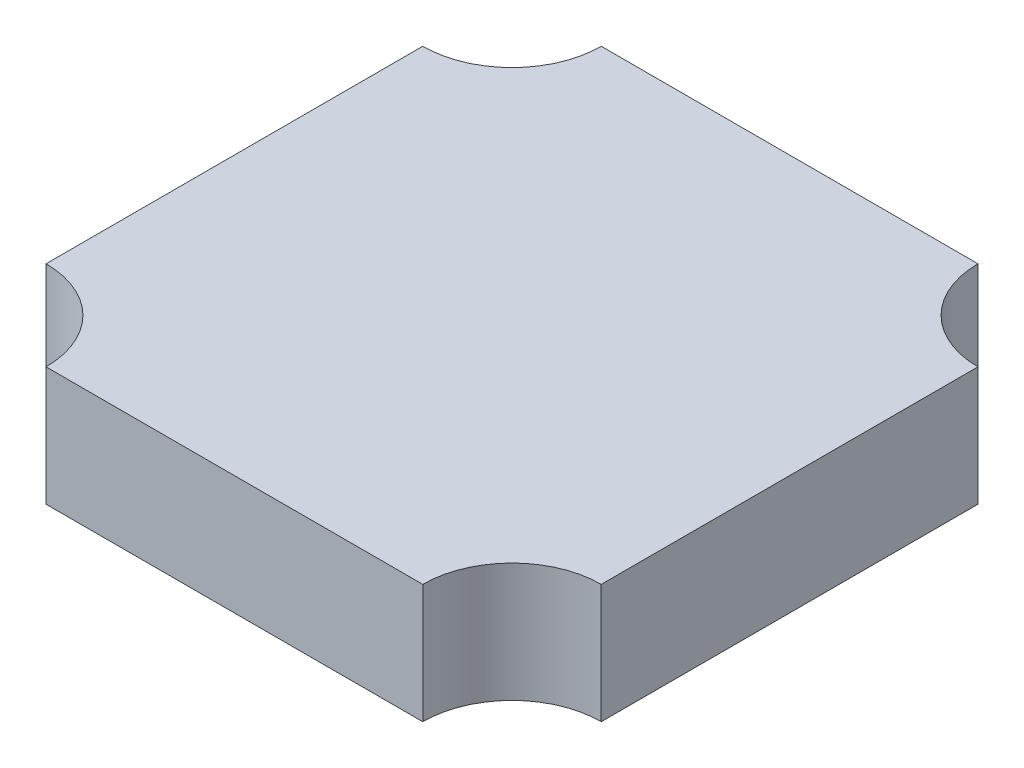
ISO-10303-21;
HEADER;
FILE_DESCRIPTION(('STEP AP214'),'2;1');
FILE_NAME('part.step','',(''),(''),'','','');
FILE_SCHEMA(('AUTOMOTIVE_DESIGN { 1 0 10303 214 1 1 1 1 }'));
ENDSEC;
DATA;
#1=APPLICATION_CONTEXT('core data for automotive mechanical design processes');
#2=APPLICATION_PROTOCOL_DEFINITION('international standard','automotive_design',2000,#1);
#3=PRODUCT_CONTEXT('',#1,'mechanical');
#4=PRODUCT('Part','Part','',(#3));
#5=PRODUCT_RELATED_PRODUCT_CATEGORY('part','',(#4));
#6=PRODUCT_DEFINITION_FORMATION('','',#4);
#7=PRODUCT_DEFINITION_CONTEXT('part definition',#1,'design');
#8=PRODUCT_DEFINITION('design','',#6,#7);
#9=PRODUCT_DEFINITION_SHAPE('','',#8);
#10=(LENGTH_UNIT() NAMED_UNIT(*) SI_UNIT(.MILLI.,.METRE.));
#11=(NAMED_UNIT(*) PLANE_ANGLE_UNIT() SI_UNIT($,.RADIAN.));
#12=(NAMED_UNIT(*) SI_UNIT($,.STERADIAN.) SOLID_ANGLE_UNIT());
#13=UNCERTAINTY_MEASURE_WITH_UNIT(LENGTH_MEASURE(1.E-05),#10,'distance_accuracy_value','');
#14=(GEOMETRIC_REPRESENTATION_CONTEXT(3) GLOBAL_UNCERTAINTY_ASSIGNED_CONTEXT((#13)) GLOBAL_UNIT_ASSIGNED_CONTEXT((#10,
#11,#12)) REPRESENTATION_CONTEXT('',''));
#15=CARTESIAN_POINT('',(0.,0.,0.));
#16=DIRECTION('',(0.,0.,1.));
#17=DIRECTION('',(1.,0.,0.));
#18=AXIS2_PLACEMENT_3D('',#15,#16,#17);
#19=CARTESIAN_POINT('',(-28.,12.,28.));
#20=DIRECTION('',(0.,-1.,0.));
#21=DIRECTION('',(0.,0.,-1.));
#22=AXIS2_PLACEMENT_3D('',#19,#20,#21);
#23=CYLINDRICAL_SURFACE('',#22,9.);
#24=CARTESIAN_POINT('',(-28.,0.,28.));
#25=DIRECTION('',(0.,-1.,0.));
#26=DIRECTION('',(0.,0.,1.));
#27=AXIS2_PLACEMENT_3D('',#24,#25,#26);
#28=CIRCLE('',#27,9.);
#29=CARTESIAN_POINT('',(-28.,0.,19.));
#30=VERTEX_POINT('',#29);
#31=CARTESIAN_POINT('',(-19.,0.,28.));
#32=VERTEX_POINT('',#31);
#33=EDGE_CURVE('E128',#30,#32,#28,.T.);
#34=ORIENTED_EDGE('',*,*,#33,.T.);
#35=DIRECTION('',(0.,-1.,0.));
#36=VECTOR('',#35,1.);
#37=CARTESIAN_POINT('',(-19.,12.,28.));
#38=LINE('',#37,#36);
#39=CARTESIAN_POINT('',(-19.,12.,28.));
#40=VERTEX_POINT('',#39);
#41=EDGE_CURVE('E11',#40,#32,#38,.T.);
#42=ORIENTED_EDGE('',*,*,#41,.F.);
#43=CARTESIAN_POINT('',(-28.,12.,28.));
#44=DIRECTION('',(0.,-1.,0.));
#45=DIRECTION('',(0.,0.,1.));
#46=AXIS2_PLACEMENT_3D('',#43,#44,#45);
#47=CIRCLE('',#46,9.);
#48=CARTESIAN_POINT('',(-28.,12.,19.));
#49=VERTEX_POINT('',#48);
#50=EDGE_CURVE('E142',#49,#40,#47,.T.);
#51=ORIENTED_EDGE('',*,*,#50,.F.);
#52=DIRECTION('',(0.,-1.,0.));
#53=VECTOR('',#52,1.);
#54=CARTESIAN_POINT('',(-28.,12.,19.));
#55=LINE('',#54,#53);
#56=EDGE_CURVE('E124',#49,#30,#55,.T.);
#57=ORIENTED_EDGE('',*,*,#56,.T.);
#58=EDGE_LOOP('',(#34,#42,#51,#57));
#59=FACE_BOUND('',#58,.T.);
#60=ADVANCED_FACE('F32',(#59),#23,.F.);
#61=CARTESIAN_POINT('',(-19.,12.,28.));
#62=DIRECTION('',(0.,0.,-1.));
#63=DIRECTION('',(-1.,0.,0.));
#64=AXIS2_PLACEMENT_3D('',#61,#62,#63);
#65=PLANE('',#64);
#66=DIRECTION('',(1.,0.,0.));
#67=VECTOR('',#66,1.);
#68=CARTESIAN_POINT('',(-19.,0.,28.));
#69=LINE('',#68,#67);
#70=CARTESIAN_POINT('',(19.,0.,28.));
#71=VERTEX_POINT('',#70);
#72=EDGE_CURVE('E131',#32,#71,#69,.T.);
#73=ORIENTED_EDGE('',*,*,#72,.T.);
#74=DIRECTION('',(0.,-1.,0.));
#75=VECTOR('',#74,1.);
#76=CARTESIAN_POINT('',(19.,12.,28.));
#77=LINE('',#76,#75);
#78=CARTESIAN_POINT('',(19.,12.,28.));
#79=VERTEX_POINT('',#78);
#80=EDGE_CURVE('E40',#79,#71,#77,.T.);
#81=ORIENTED_EDGE('',*,*,#80,.F.);
#82=DIRECTION('',(1.,0.,0.));
#83=VECTOR('',#82,1.);
#84=CARTESIAN_POINT('',(-19.,12.,28.));
#85=LINE('',#84,#83);
#86=EDGE_CURVE('E91',#40,#79,#85,.T.);
#87=ORIENTED_EDGE('',*,*,#86,.F.);
#88=ORIENTED_EDGE('',*,*,#41,.T.);
#89=EDGE_LOOP('',(#73,#81,#87,#88));
#90=FACE_BOUND('',#89,.T.);
#91=ADVANCED_FACE('F177',(#90),#65,.F.);
#92=CARTESIAN_POINT('',(28.,12.,28.));
#93=DIRECTION('',(0.,-1.,0.));
#94=DIRECTION('',(0.,0.,-1.));
#95=AXIS2_PLACEMENT_3D('',#92,#93,#94);
#96=CYLINDRICAL_SURFACE('',#95,9.);
#97=CARTESIAN_POINT('',(28.,0.,28.));
#98=DIRECTION('',(0.,-1.,0.));
#99=DIRECTION('',(0.,0.,1.));
#100=AXIS2_PLACEMENT_3D('',#97,#98,#99);
#101=CIRCLE('',#100,9.);
#102=CARTESIAN_POINT('',(28.,0.,19.));
#103=VERTEX_POINT('',#102);
#104=EDGE_CURVE('E133',#71,#103,#101,.T.);
#105=ORIENTED_EDGE('',*,*,#104,.T.);
#106=DIRECTION('',(0.,-1.,0.));
#107=VECTOR('',#106,1.);
#108=CARTESIAN_POINT('',(28.,12.,19.));
#109=LINE('',#108,#107);
#110=CARTESIAN_POINT('',(28.,12.,19.));
#111=VERTEX_POINT('',#110);
#112=EDGE_CURVE('E149',#111,#103,#109,.T.);
#113=ORIENTED_EDGE('',*,*,#112,.F.);
#114=CARTESIAN_POINT('',(28.,12.,28.));
#115=DIRECTION('',(0.,-1.,0.));
#116=DIRECTION('',(0.,0.,1.));
#117=AXIS2_PLACEMENT_3D('',#114,#115,#116);
#118=CIRCLE('',#117,9.);
#119=EDGE_CURVE('E157',#79,#111,#118,.T.);
#120=ORIENTED_EDGE('',*,*,#119,.F.);
#121=ORIENTED_EDGE('',*,*,#80,.T.);
#122=EDGE_LOOP('',(#105,#113,#120,#121));
#123=FACE_BOUND('',#122,.T.);
#124=ADVANCED_FACE('F155',(#123),#96,.F.);
#125=CARTESIAN_POINT('',(28.,12.,-19.));
#126=DIRECTION('',(-1.,0.,0.));
#127=DIRECTION('',(0.,0.,1.));
#128=AXIS2_PLACEMENT_3D('',#125,#126,#127);
#129=PLANE('',#128);
#130=DIRECTION('',(0.,0.,-1.));
#131=VECTOR('',#130,1.);
#132=CARTESIAN_POINT('',(28.,0.,-19.));
#133=LINE('',#132,#131);
#134=CARTESIAN_POINT('',(28.,0.,-19.));
#135=VERTEX_POINT('',#134);
#136=EDGE_CURVE('E135',#103,#135,#133,.T.);
#137=ORIENTED_EDGE('',*,*,#136,.T.);
#138=DIRECTION('',(0.,-1.,0.));
#139=VECTOR('',#138,1.);
#140=CARTESIAN_POINT('',(28.,12.,-19.));
#141=LINE('',#140,#139);
#142=CARTESIAN_POINT('',(28.,12.,-19.));
#143=VERTEX_POINT('',#142);
#144=EDGE_CURVE('E146',#143,#135,#141,.T.);
#145=ORIENTED_EDGE('',*,*,#144,.F.);
#146=DIRECTION('',(0.,0.,-1.));
#147=VECTOR('',#146,1.);
#148=CARTESIAN_POINT('',(28.,12.,-19.));
#149=LINE('',#148,#147);
#150=EDGE_CURVE('E169',#111,#143,#149,.T.);
#151=ORIENTED_EDGE('',*,*,#150,.F.);
#152=ORIENTED_EDGE('',*,*,#112,.T.);
#153=EDGE_LOOP('',(#137,#145,#151,#152));
#154=FACE_BOUND('',#153,.T.);
#155=ADVANCED_FACE('F165',(#154),#129,.F.);
#156=CARTESIAN_POINT('',(28.,12.,-28.));
#157=DIRECTION('',(0.,-1.,0.));
#158=DIRECTION('',(0.,0.,-1.));
#159=AXIS2_PLACEMENT_3D('',#156,#157,#158);
#160=CYLINDRICAL_SURFACE('',#159,9.);
#161=CARTESIAN_POINT('',(28.,0.,-28.));
#162=DIRECTION('',(0.,-1.,0.));
#163=DIRECTION('',(0.,0.,1.));
#164=AXIS2_PLACEMENT_3D('',#161,#162,#163);
#165=CIRCLE('',#164,9.);
#166=CARTESIAN_POINT('',(19.,0.,-28.));
#167=VERTEX_POINT('',#166);
#168=EDGE_CURVE('E137',#135,#167,#165,.T.);
#169=ORIENTED_EDGE('',*,*,#168,.T.);
#170=DIRECTION('',(0.,-1.,0.));
#171=VECTOR('',#170,1.);
#172=CARTESIAN_POINT('',(19.,12.,-28.));
#173=LINE('',#172,#171);
#174=CARTESIAN_POINT('',(19.,12.,-28.));
#175=VERTEX_POINT('',#174);
#176=EDGE_CURVE('E119',#175,#167,#173,.T.);
#177=ORIENTED_EDGE('',*,*,#176,.F.);
#178=CARTESIAN_POINT('',(28.,12.,-28.));
#179=DIRECTION('',(0.,-1.,0.));
#180=DIRECTION('',(0.,0.,1.));
#181=AXIS2_PLACEMENT_3D('',#178,#179,#180);
#182=CIRCLE('',#181,9.);
#183=EDGE_CURVE('E110',#143,#175,#182,.T.);
#184=ORIENTED_EDGE('',*,*,#183,.F.);
#185=ORIENTED_EDGE('',*,*,#144,.T.);
#186=EDGE_LOOP('',(#169,#177,#184,#185));
#187=FACE_BOUND('',#186,.T.);
#188=ADVANCED_FACE('F168',(#187),#160,.F.);
#189=CARTESIAN_POINT('',(-19.,12.,-28.));
#190=DIRECTION('',(0.,0.,1.));
#191=DIRECTION('',(1.,0.,0.));
#192=AXIS2_PLACEMENT_3D('',#189,#190,#191);
#193=PLANE('',#192);
#194=DIRECTION('',(-1.,0.,0.));
#195=VECTOR('',#194,1.);
#196=CARTESIAN_POINT('',(-19.,0.,-28.));
#197=LINE('',#196,#195);
#198=CARTESIAN_POINT('',(-19.,0.,-28.));
#199=VERTEX_POINT('',#198);
#200=EDGE_CURVE('E118',#167,#199,#197,.T.);
#201=ORIENTED_EDGE('',*,*,#200,.T.);
#202=DIRECTION('',(0.,-1.,0.));
#203=VECTOR('',#202,1.);
#204=CARTESIAN_POINT('',(-19.,12.,-28.));
#205=LINE('',#204,#203);
#206=CARTESIAN_POINT('',(-19.,12.,-28.));
#207=VERTEX_POINT('',#206);
#208=EDGE_CURVE('E115',#207,#199,#205,.T.);
#209=ORIENTED_EDGE('',*,*,#208,.F.);
#210=DIRECTION('',(-1.,0.,0.));
#211=VECTOR('',#210,1.);
#212=CARTESIAN_POINT('',(-19.,12.,-28.));
#213=LINE('',#212,#211);
#214=EDGE_CURVE('E104',#175,#207,#213,.T.);
#215=ORIENTED_EDGE('',*,*,#214,.F.);
#216=ORIENTED_EDGE('',*,*,#176,.T.);
#217=EDGE_LOOP('',(#201,#209,#215,#216));
#218=FACE_BOUND('',#217,.T.);
#219=ADVANCED_FACE('F116',(#218),#193,.F.);
#220=CARTESIAN_POINT('',(-28.,12.,-28.));
#221=DIRECTION('',(0.,-1.,0.));
#222=DIRECTION('',(0.,0.,-1.));
#223=AXIS2_PLACEMENT_3D('',#220,#221,#222);
#224=CYLINDRICAL_SURFACE('',#223,9.);
#225=CARTESIAN_POINT('',(-28.,0.,-28.));
#226=DIRECTION('',(0.,-1.,0.));
#227=DIRECTION('',(0.,0.,1.));
#228=AXIS2_PLACEMENT_3D('',#225,#226,#227);
#229=CIRCLE('',#228,9.);
#230=CARTESIAN_POINT('',(-28.,0.,-19.));
#231=VERTEX_POINT('',#230);
#232=EDGE_CURVE('E77',#199,#231,#229,.T.);
#233=ORIENTED_EDGE('',*,*,#232,.T.);
#234=DIRECTION('',(0.,-1.,0.));
#235=VECTOR('',#234,1.);
#236=CARTESIAN_POINT('',(-28.,12.,-19.));
#237=LINE('',#236,#235);
#238=CARTESIAN_POINT('',(-28.,12.,-19.));
#239=VERTEX_POINT('',#238);
#240=EDGE_CURVE('E120',#239,#231,#237,.T.);
#241=ORIENTED_EDGE('',*,*,#240,.F.);
#242=CARTESIAN_POINT('',(-28.,12.,-28.));
#243=DIRECTION('',(0.,-1.,0.));
#244=DIRECTION('',(0.,0.,1.));
#245=AXIS2_PLACEMENT_3D('',#242,#243,#244);
#246=CIRCLE('',#245,9.);
#247=EDGE_CURVE('E108',#207,#239,#246,.T.);
#248=ORIENTED_EDGE('',*,*,#247,.F.);
#249=ORIENTED_EDGE('',*,*,#208,.T.);
#250=EDGE_LOOP('',(#233,#241,#248,#249));
#251=FACE_BOUND('',#250,.T.);
#252=ADVANCED_FACE('F122',(#251),#224,.F.);
#253=CARTESIAN_POINT('',(-28.,12.,-19.));
#254=DIRECTION('',(1.,0.,0.));
#255=DIRECTION('',(0.,0.,-1.));
#256=AXIS2_PLACEMENT_3D('',#253,#254,#255);
#257=PLANE('',#256);
#258=DIRECTION('',(0.,0.,1.));
#259=VECTOR('',#258,1.);
#260=CARTESIAN_POINT('',(-28.,0.,-19.));
#261=LINE('',#260,#259);
#262=EDGE_CURVE('E83',#231,#30,#261,.T.);
#263=ORIENTED_EDGE('',*,*,#262,.T.);
#264=ORIENTED_EDGE('',*,*,#56,.F.);
#265=DIRECTION('',(0.,0.,1.));
#266=VECTOR('',#265,1.);
#267=CARTESIAN_POINT('',(-28.,12.,-19.));
#268=LINE('',#267,#266);
#269=EDGE_CURVE('E48',#239,#49,#268,.T.);
#270=ORIENTED_EDGE('',*,*,#269,.F.);
#271=ORIENTED_EDGE('',*,*,#240,.T.);
#272=EDGE_LOOP('',(#263,#264,#270,#271));
#273=FACE_BOUND('',#272,.T.);
#274=ADVANCED_FACE('F193',(#273),#257,.F.);
#275=CARTESIAN_POINT('',(-28.,12.,28.));
#276=DIRECTION('',(0.,1.,0.));
#277=DIRECTION('',(0.,0.,1.));
#278=AXIS2_PLACEMENT_3D('',#275,#276,#277);
#279=PLANE('',#278);
#280=ORIENTED_EDGE('',*,*,#50,.T.);
#281=ORIENTED_EDGE('',*,*,#86,.T.);
#282=ORIENTED_EDGE('',*,*,#119,.T.);
#283=ORIENTED_EDGE('',*,*,#150,.T.);
#284=ORIENTED_EDGE('',*,*,#183,.T.);
#285=ORIENTED_EDGE('',*,*,#214,.T.);
#286=ORIENTED_EDGE('',*,*,#247,.T.);
#287=ORIENTED_EDGE('',*,*,#269,.T.);
#288=EDGE_LOOP('',(#280,#281,#282,#283,#284,#285,#286,#287));
#289=FACE_BOUND('',#288,.T.);
#290=ADVANCED_FACE('F106',(#289),#279,.T.);
#291=CARTESIAN_POINT('',(-28.,0.,28.));
#292=DIRECTION('',(0.,1.,0.));
#293=DIRECTION('',(0.,0.,1.));
#294=AXIS2_PLACEMENT_3D('',#291,#292,#293);
#295=PLANE('',#294);
#296=ORIENTED_EDGE('',*,*,#33,.F.);
#297=ORIENTED_EDGE('',*,*,#262,.F.);
#298=ORIENTED_EDGE('',*,*,#232,.F.);
#299=ORIENTED_EDGE('',*,*,#200,.F.);
#300=ORIENTED_EDGE('',*,*,#168,.F.);
#301=ORIENTED_EDGE('',*,*,#136,.F.);
#302=ORIENTED_EDGE('',*,*,#104,.F.);
#303=ORIENTED_EDGE('',*,*,#72,.F.);
#304=EDGE_LOOP('',(#296,#297,#298,#299,#300,#301,#302,#303));
#305=FACE_BOUND('',#304,.T.);
#306=ADVANCED_FACE('F161',(#305),#295,.F.);
#307=CLOSED_SHELL('',(#60,#91,#124,#155,#188,#219,#252,#274,#290,#306));
#308=MANIFOLD_SOLID_BREP('B2',#307);
#309=ADVANCED_BREP_SHAPE_REPRESENTATION('',(#18,#308),#14);
#310=SHAPE_DEFINITION_REPRESENTATION(#9,#309);
ENDSEC;
END-ISO-10303-21;
